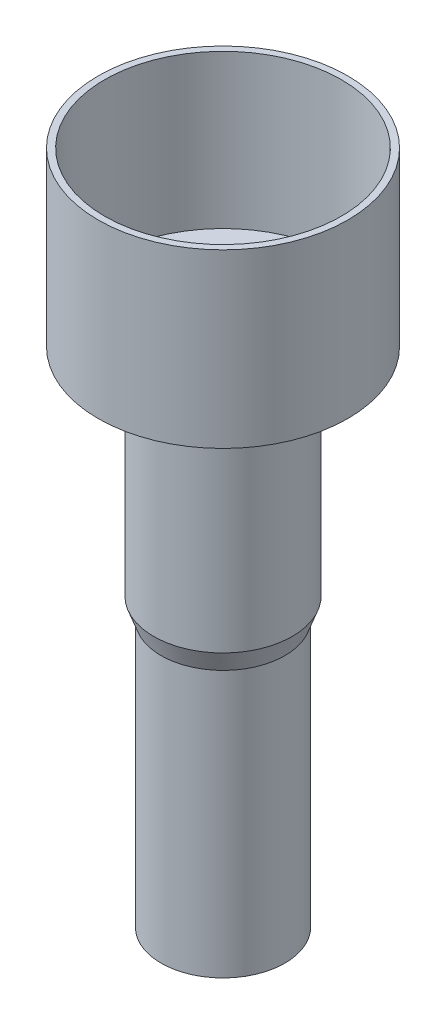
ISO-10303-21;
HEADER;
FILE_DESCRIPTION(('STEP AP214'),'2;1');
FILE_NAME('part.step','',(''),(''),'','','');
FILE_SCHEMA(('AUTOMOTIVE_DESIGN { 1 0 10303 214 1 1 1 1 }'));
ENDSEC;
DATA;
#1=APPLICATION_CONTEXT('core data for automotive mechanical design processes');
#2=APPLICATION_PROTOCOL_DEFINITION('international standard','automotive_design',2000,#1);
#3=PRODUCT_CONTEXT('',#1,'mechanical');
#4=PRODUCT('Part','Part','',(#3));
#5=PRODUCT_RELATED_PRODUCT_CATEGORY('part','',(#4));
#6=PRODUCT_DEFINITION_FORMATION('','',#4);
#7=PRODUCT_DEFINITION_CONTEXT('part definition',#1,'design');
#8=PRODUCT_DEFINITION('design','',#6,#7);
#9=PRODUCT_DEFINITION_SHAPE('','',#8);
#10=(LENGTH_UNIT() NAMED_UNIT(*) SI_UNIT(.MILLI.,.METRE.));
#11=(NAMED_UNIT(*) PLANE_ANGLE_UNIT() SI_UNIT($,.RADIAN.));
#12=(NAMED_UNIT(*) SI_UNIT($,.STERADIAN.) SOLID_ANGLE_UNIT());
#13=UNCERTAINTY_MEASURE_WITH_UNIT(LENGTH_MEASURE(1.E-05),#10,'distance_accuracy_value','');
#14=(GEOMETRIC_REPRESENTATION_CONTEXT(3) GLOBAL_UNCERTAINTY_ASSIGNED_CONTEXT((#13)) GLOBAL_UNIT_ASSIGNED_CONTEXT((#10,
#11,#12)) REPRESENTATION_CONTEXT('',''));
#15=CARTESIAN_POINT('',(0.,0.,0.));
#16=DIRECTION('',(0.,0.,1.));
#17=DIRECTION('',(1.,0.,0.));
#18=AXIS2_PLACEMENT_3D('',#15,#16,#17);
#19=CARTESIAN_POINT('',(0.,0.,0.));
#20=DIRECTION('',(0.,-1.,0.));
#21=DIRECTION('',(0.,0.,-1.));
#22=AXIS2_PLACEMENT_3D('',#19,#20,#21);
#23=CYLINDRICAL_SURFACE('',#22,3.35);
#24=CARTESIAN_POINT('',(0.,0.,0.));
#25=DIRECTION('',(0.,-1.,0.));
#26=DIRECTION('',(0.,0.,-1.));
#27=AXIS2_PLACEMENT_3D('',#24,#25,#26);
#28=CIRCLE('',#27,3.35);
#29=CARTESIAN_POINT('',(0.,0.,-3.35));
#30=VERTEX_POINT('',#29);
#31=EDGE_CURVE('E10',#30,#30,#28,.T.);
#32=ORIENTED_EDGE('',*,*,#31,.F.);
#33=EDGE_LOOP('',(#32));
#34=FACE_BOUND('',#33,.T.);
#35=CARTESIAN_POINT('',(0.,14.4010090322182,0.));
#36=DIRECTION('',(0.,-1.,0.));
#37=DIRECTION('',(0.,0.,-1.));
#38=AXIS2_PLACEMENT_3D('',#35,#36,#37);
#39=CIRCLE('',#38,3.35);
#40=CARTESIAN_POINT('',(0.,14.4010090322182,-3.35));
#41=VERTEX_POINT('',#40);
#42=EDGE_CURVE('E78',#41,#41,#39,.T.);
#43=ORIENTED_EDGE('',*,*,#42,.T.);
#44=EDGE_LOOP('',(#43));
#45=FACE_BOUND('',#44,.T.);
#46=ADVANCED_FACE('F32',(#34,#45),#23,.T.);
#47=CARTESIAN_POINT('',(0.,0.,0.));
#48=DIRECTION('',(0.,1.,0.));
#49=DIRECTION('',(0.,0.,1.));
#50=AXIS2_PLACEMENT_3D('',#47,#48,#49);
#51=PLANE('',#50);
#52=CARTESIAN_POINT('',(0.,0.,0.));
#53=DIRECTION('',(0.,-1.,0.));
#54=DIRECTION('',(0.,0.,-1.));
#55=AXIS2_PLACEMENT_3D('',#52,#53,#54);
#56=CIRCLE('',#55,2.15);
#57=CARTESIAN_POINT('',(0.,0.,-2.15));
#58=VERTEX_POINT('',#57);
#59=EDGE_CURVE('E38',#58,#58,#56,.T.);
#60=ORIENTED_EDGE('',*,*,#59,.F.);
#61=EDGE_LOOP('',(#60));
#62=FACE_BOUND('',#61,.T.);
#63=ORIENTED_EDGE('',*,*,#31,.T.);
#64=EDGE_LOOP('',(#63));
#65=FACE_BOUND('',#64,.T.);
#66=ADVANCED_FACE('F125',(#62,#65),#51,.F.);
#67=CARTESIAN_POINT('',(0.,0.,0.));
#68=DIRECTION('',(0.,-1.,0.));
#69=DIRECTION('',(0.,0.,-1.));
#70=AXIS2_PLACEMENT_3D('',#67,#68,#69);
#71=CYLINDRICAL_SURFACE('',#70,2.15);
#72=ORIENTED_EDGE('',*,*,#59,.T.);
#73=EDGE_LOOP('',(#72));
#74=FACE_BOUND('',#73,.T.);
#75=CARTESIAN_POINT('',(0.,23.,0.));
#76=DIRECTION('',(0.,-1.,0.));
#77=DIRECTION('',(0.,0.,-1.));
#78=AXIS2_PLACEMENT_3D('',#75,#76,#77);
#79=CIRCLE('',#78,2.15);
#80=CARTESIAN_POINT('',(0.,23.,-2.15));
#81=VERTEX_POINT('',#80);
#82=EDGE_CURVE('E42',#81,#81,#79,.T.);
#83=ORIENTED_EDGE('',*,*,#82,.F.);
#84=EDGE_LOOP('',(#83));
#85=FACE_BOUND('',#84,.T.);
#86=ADVANCED_FACE('F130',(#74,#85),#71,.F.);
#87=CARTESIAN_POINT('',(0.,23.,0.));
#88=DIRECTION('',(0.,-1.,0.));
#89=DIRECTION('',(0.,0.,-1.));
#90=AXIS2_PLACEMENT_3D('',#87,#88,#89);
#91=PLANE('',#90);
#92=ORIENTED_EDGE('',*,*,#82,.T.);
#93=EDGE_LOOP('',(#92));
#94=FACE_BOUND('',#93,.T.);
#95=CARTESIAN_POINT('',(0.,23.,0.));
#96=DIRECTION('',(0.,-1.,0.));
#97=DIRECTION('',(0.,0.,-1.));
#98=AXIS2_PLACEMENT_3D('',#95,#96,#97);
#99=CIRCLE('',#98,1.5);
#100=CARTESIAN_POINT('',(0.,23.,-1.5));
#101=VERTEX_POINT('',#100);
#102=EDGE_CURVE('E46',#101,#101,#99,.T.);
#103=ORIENTED_EDGE('',*,*,#102,.F.);
#104=EDGE_LOOP('',(#103));
#105=FACE_BOUND('',#104,.T.);
#106=ADVANCED_FACE('F135',(#94,#105),#91,.T.);
#107=CARTESIAN_POINT('',(0.,0.,0.));
#108=DIRECTION('',(0.,-1.,0.));
#109=DIRECTION('',(0.,0.,-1.));
#110=AXIS2_PLACEMENT_3D('',#107,#108,#109);
#111=CYLINDRICAL_SURFACE('',#110,1.5);
#112=ORIENTED_EDGE('',*,*,#102,.T.);
#113=EDGE_LOOP('',(#112));
#114=FACE_BOUND('',#113,.T.);
#115=CARTESIAN_POINT('',(0.,24.,0.));
#116=DIRECTION('',(0.,-1.,0.));
#117=DIRECTION('',(0.,0.,-1.));
#118=AXIS2_PLACEMENT_3D('',#115,#116,#117);
#119=CIRCLE('',#118,1.5);
#120=CARTESIAN_POINT('',(0.,24.,-1.5));
#121=VERTEX_POINT('',#120);
#122=EDGE_CURVE('E51',#121,#121,#119,.T.);
#123=ORIENTED_EDGE('',*,*,#122,.F.);
#124=EDGE_LOOP('',(#123));
#125=FACE_BOUND('',#124,.T.);
#126=ADVANCED_FACE('F140',(#114,#125),#111,.F.);
#127=CARTESIAN_POINT('',(0.,24.,0.));
#128=DIRECTION('',(0.,1.,0.));
#129=DIRECTION('',(0.,0.,1.));
#130=AXIS2_PLACEMENT_3D('',#127,#128,#129);
#131=PLANE('',#130);
#132=ORIENTED_EDGE('',*,*,#122,.T.);
#133=EDGE_LOOP('',(#132));
#134=FACE_BOUND('',#133,.T.);
#135=CARTESIAN_POINT('',(0.,24.,0.));
#136=DIRECTION('',(0.,-1.,0.));
#137=DIRECTION('',(0.,0.,-1.));
#138=AXIS2_PLACEMENT_3D('',#135,#136,#137);
#139=CIRCLE('',#138,2.1);
#140=CARTESIAN_POINT('',(0.,24.,-2.1));
#141=VERTEX_POINT('',#140);
#142=EDGE_CURVE('E54',#141,#141,#139,.T.);
#143=ORIENTED_EDGE('',*,*,#142,.F.);
#144=EDGE_LOOP('',(#143));
#145=FACE_BOUND('',#144,.T.);
#146=ADVANCED_FACE('F144',(#134,#145),#131,.T.);
#147=CARTESIAN_POINT('',(0.,0.,0.));
#148=DIRECTION('',(0.,-1.,0.));
#149=DIRECTION('',(0.,0.,-1.));
#150=AXIS2_PLACEMENT_3D('',#147,#148,#149);
#151=CYLINDRICAL_SURFACE('',#150,2.1);
#152=ORIENTED_EDGE('',*,*,#142,.T.);
#153=EDGE_LOOP('',(#152));
#154=FACE_BOUND('',#153,.T.);
#155=CARTESIAN_POINT('',(0.,28.2,0.));
#156=DIRECTION('',(0.,-1.,0.));
#157=DIRECTION('',(0.,0.,-1.));
#158=AXIS2_PLACEMENT_3D('',#155,#156,#157);
#159=CIRCLE('',#158,2.1);
#160=CARTESIAN_POINT('',(0.,28.2,-2.1));
#161=VERTEX_POINT('',#160);
#162=EDGE_CURVE('E57',#161,#161,#159,.T.);
#163=ORIENTED_EDGE('',*,*,#162,.F.);
#164=EDGE_LOOP('',(#163));
#165=FACE_BOUND('',#164,.T.);
#166=ADVANCED_FACE('F121',(#154,#165),#151,.F.);
#167=CARTESIAN_POINT('',(0.,28.2,0.));
#168=DIRECTION('',(0.,1.,0.));
#169=DIRECTION('',(0.,0.,1.));
#170=AXIS2_PLACEMENT_3D('',#167,#168,#169);
#171=PLANE('',#170);
#172=ORIENTED_EDGE('',*,*,#162,.T.);
#173=EDGE_LOOP('',(#172));
#174=FACE_BOUND('',#173,.T.);
#175=CARTESIAN_POINT('',(0.,28.2,0.));
#176=DIRECTION('',(0.,-1.,0.));
#177=DIRECTION('',(0.,0.,-1.));
#178=AXIS2_PLACEMENT_3D('',#175,#176,#177);
#179=CIRCLE('',#178,6.4);
#180=CARTESIAN_POINT('',(0.,28.2,-6.4));
#181=VERTEX_POINT('',#180);
#182=EDGE_CURVE('E60',#181,#181,#179,.T.);
#183=ORIENTED_EDGE('',*,*,#182,.F.);
#184=EDGE_LOOP('',(#183));
#185=FACE_BOUND('',#184,.T.);
#186=ADVANCED_FACE('F115',(#174,#185),#171,.T.);
#187=CARTESIAN_POINT('',(0.,0.,0.));
#188=DIRECTION('',(0.,-1.,0.));
#189=DIRECTION('',(0.,0.,-1.));
#190=AXIS2_PLACEMENT_3D('',#187,#188,#189);
#191=CYLINDRICAL_SURFACE('',#190,6.4);
#192=ORIENTED_EDGE('',*,*,#182,.T.);
#193=EDGE_LOOP('',(#192));
#194=FACE_BOUND('',#193,.T.);
#195=CARTESIAN_POINT('',(0.,36.5,0.));
#196=DIRECTION('',(0.,-1.,0.));
#197=DIRECTION('',(0.,0.,-1.));
#198=AXIS2_PLACEMENT_3D('',#195,#196,#197);
#199=CIRCLE('',#198,6.4);
#200=CARTESIAN_POINT('',(0.,36.5,-6.4));
#201=VERTEX_POINT('',#200);
#202=EDGE_CURVE('E63',#201,#201,#199,.T.);
#203=ORIENTED_EDGE('',*,*,#202,.F.);
#204=EDGE_LOOP('',(#203));
#205=FACE_BOUND('',#204,.T.);
#206=ADVANCED_FACE('F110',(#194,#205),#191,.F.);
#207=CARTESIAN_POINT('',(0.,36.5,0.));
#208=DIRECTION('',(0.,-1.,0.));
#209=DIRECTION('',(0.,0.,-1.));
#210=AXIS2_PLACEMENT_3D('',#207,#208,#209);
#211=PLANE('',#210);
#212=CARTESIAN_POINT('',(0.,36.5,0.));
#213=DIRECTION('',(0.,-1.,0.));
#214=DIRECTION('',(0.,0.,-1.));
#215=AXIS2_PLACEMENT_3D('',#212,#213,#214);
#216=CIRCLE('',#215,6.75);
#217=CARTESIAN_POINT('',(0.,36.5,-6.75));
#218=VERTEX_POINT('',#217);
#219=EDGE_CURVE('E66',#218,#218,#216,.T.);
#220=ORIENTED_EDGE('',*,*,#219,.F.);
#221=EDGE_LOOP('',(#220));
#222=FACE_BOUND('',#221,.T.);
#223=ORIENTED_EDGE('',*,*,#202,.T.);
#224=EDGE_LOOP('',(#223));
#225=FACE_BOUND('',#224,.T.);
#226=ADVANCED_FACE('F104',(#222,#225),#211,.F.);
#227=CARTESIAN_POINT('',(0.,0.,0.));
#228=DIRECTION('',(0.,-1.,0.));
#229=DIRECTION('',(0.,0.,-1.));
#230=AXIS2_PLACEMENT_3D('',#227,#228,#229);
#231=CYLINDRICAL_SURFACE('',#230,6.75);
#232=CARTESIAN_POINT('',(0.,27.2,0.));
#233=DIRECTION('',(0.,-1.,0.));
#234=DIRECTION('',(0.,0.,-1.));
#235=AXIS2_PLACEMENT_3D('',#232,#233,#234);
#236=CIRCLE('',#235,6.75);
#237=CARTESIAN_POINT('',(0.,27.2,-6.75));
#238=VERTEX_POINT('',#237);
#239=EDGE_CURVE('E69',#238,#238,#236,.T.);
#240=ORIENTED_EDGE('',*,*,#239,.F.);
#241=EDGE_LOOP('',(#240));
#242=FACE_BOUND('',#241,.T.);
#243=ORIENTED_EDGE('',*,*,#219,.T.);
#244=EDGE_LOOP('',(#243));
#245=FACE_BOUND('',#244,.T.);
#246=ADVANCED_FACE('F98',(#242,#245),#231,.T.);
#247=CARTESIAN_POINT('',(0.,27.2,0.));
#248=DIRECTION('',(0.,1.,0.));
#249=DIRECTION('',(0.,0.,1.));
#250=AXIS2_PLACEMENT_3D('',#247,#248,#249);
#251=PLANE('',#250);
#252=CARTESIAN_POINT('',(0.,27.2,0.));
#253=DIRECTION('',(0.,-1.,0.));
#254=DIRECTION('',(0.,0.,-1.));
#255=AXIS2_PLACEMENT_3D('',#252,#253,#254);
#256=CIRCLE('',#255,3.75);
#257=CARTESIAN_POINT('',(0.,27.2,-3.75));
#258=VERTEX_POINT('',#257);
#259=EDGE_CURVE('E72',#258,#258,#256,.T.);
#260=ORIENTED_EDGE('',*,*,#259,.F.);
#261=EDGE_LOOP('',(#260));
#262=FACE_BOUND('',#261,.T.);
#263=ORIENTED_EDGE('',*,*,#239,.T.);
#264=EDGE_LOOP('',(#263));
#265=FACE_BOUND('',#264,.T.);
#266=ADVANCED_FACE('F92',(#262,#265),#251,.F.);
#267=CARTESIAN_POINT('',(0.,0.,0.));
#268=DIRECTION('',(0.,-1.,0.));
#269=DIRECTION('',(0.,0.,-1.));
#270=AXIS2_PLACEMENT_3D('',#267,#268,#269);
#271=CYLINDRICAL_SURFACE('',#270,3.75);
#272=CARTESIAN_POINT('',(0.,15.5,0.));
#273=DIRECTION('',(0.,-1.,0.));
#274=DIRECTION('',(0.,0.,-1.));
#275=AXIS2_PLACEMENT_3D('',#272,#273,#274);
#276=CIRCLE('',#275,3.75);
#277=CARTESIAN_POINT('',(0.,15.5,-3.75));
#278=VERTEX_POINT('',#277);
#279=EDGE_CURVE('E75',#278,#278,#276,.T.);
#280=ORIENTED_EDGE('',*,*,#279,.F.);
#281=EDGE_LOOP('',(#280));
#282=FACE_BOUND('',#281,.T.);
#283=ORIENTED_EDGE('',*,*,#259,.T.);
#284=EDGE_LOOP('',(#283));
#285=FACE_BOUND('',#284,.T.);
#286=ADVANCED_FACE('F86',(#282,#285),#271,.T.);
#287=CARTESIAN_POINT('',(0.,15.5,0.));
#288=DIRECTION('',(0.,1.,0.));
#289=DIRECTION('',(0.,0.,1.));
#290=AXIS2_PLACEMENT_3D('',#287,#288,#289);
#291=CONICAL_SURFACE('',#290,3.75,0.349065850398867);
#292=ORIENTED_EDGE('',*,*,#42,.F.);
#293=EDGE_LOOP('',(#292));
#294=FACE_BOUND('',#293,.T.);
#295=ORIENTED_EDGE('',*,*,#279,.T.);
#296=EDGE_LOOP('',(#295));
#297=FACE_BOUND('',#296,.T.);
#298=ADVANCED_FACE('F83',(#294,#297),#291,.T.);
#299=CLOSED_SHELL('',(#46,#66,#86,#106,#126,#146,#166,#186,#206,#226,#246,#266,#286,#298));
#300=MANIFOLD_SOLID_BREP('B2',#299);
#301=ADVANCED_BREP_SHAPE_REPRESENTATION('',(#18,#300),#14);
#302=SHAPE_DEFINITION_REPRESENTATION(#9,#301);
ENDSEC;
END-ISO-10303-21;
